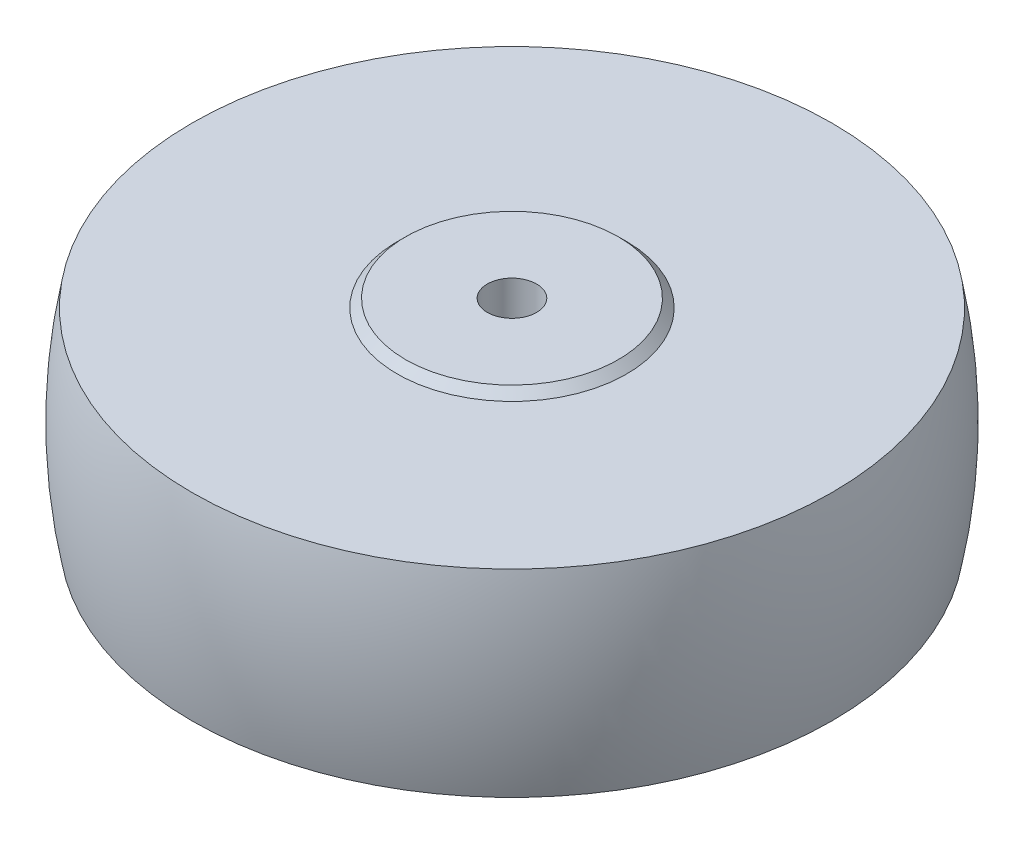
ISO-10303-21;
HEADER;
FILE_DESCRIPTION(('STEP AP214'),'2;1');
FILE_NAME('part.step','',(''),(''),'','','');
FILE_SCHEMA(('AUTOMOTIVE_DESIGN { 1 0 10303 214 1 1 1 1 }'));
ENDSEC;
DATA;
#1=APPLICATION_CONTEXT('core data for automotive mechanical design processes');
#2=APPLICATION_PROTOCOL_DEFINITION('international standard','automotive_design',2000,#1);
#3=PRODUCT_CONTEXT('',#1,'mechanical');
#4=PRODUCT('Part','Part','',(#3));
#5=PRODUCT_RELATED_PRODUCT_CATEGORY('part','',(#4));
#6=PRODUCT_DEFINITION_FORMATION('','',#4);
#7=PRODUCT_DEFINITION_CONTEXT('part definition',#1,'design');
#8=PRODUCT_DEFINITION('design','',#6,#7);
#9=PRODUCT_DEFINITION_SHAPE('','',#8);
#10=(LENGTH_UNIT() NAMED_UNIT(*) SI_UNIT(.MILLI.,.METRE.));
#11=(NAMED_UNIT(*) PLANE_ANGLE_UNIT() SI_UNIT($,.RADIAN.));
#12=(NAMED_UNIT(*) SI_UNIT($,.STERADIAN.) SOLID_ANGLE_UNIT());
#13=UNCERTAINTY_MEASURE_WITH_UNIT(LENGTH_MEASURE(1.E-05),#10,'distance_accuracy_value','');
#14=(GEOMETRIC_REPRESENTATION_CONTEXT(3) GLOBAL_UNCERTAINTY_ASSIGNED_CONTEXT((#13)) GLOBAL_UNIT_ASSIGNED_CONTEXT((#10,
#11,#12)) REPRESENTATION_CONTEXT('',''));
#15=CARTESIAN_POINT('',(0.,0.,0.));
#16=DIRECTION('',(0.,0.,1.));
#17=DIRECTION('',(1.,0.,0.));
#18=AXIS2_PLACEMENT_3D('',#15,#16,#17);
#19=CARTESIAN_POINT('',(-134.421042755759,201.725126118079,146.716684572446));
#20=DIRECTION('',(0.,-1.,0.));
#21=DIRECTION('',(-1.,0.,0.));
#22=AXIS2_PLACEMENT_3D('',#19,#20,#21);
#23=PLANE('',#22);
#24=CARTESIAN_POINT('',(-134.421042755759,201.725126118079,156.216684572446));
#25=DIRECTION('',(0.,-1.,0.));
#26=DIRECTION('',(0.,0.,1.));
#27=AXIS2_PLACEMENT_3D('',#24,#25,#26);
#28=CIRCLE('',#27,9.5);
#29=CARTESIAN_POINT('',(-134.421042755759,201.725126118079,165.716684572446));
#30=VERTEX_POINT('',#29);
#31=EDGE_CURVE('E71',#30,#30,#28,.T.);
#32=ORIENTED_EDGE('',*,*,#31,.T.);
#33=EDGE_LOOP('',(#32));
#34=FACE_BOUND('',#33,.T.);
#35=CARTESIAN_POINT('',(-134.421042755759,201.725126118079,156.216684572446));
#36=DIRECTION('',(0.,-1.,0.));
#37=DIRECTION('',(0.,0.,1.));
#38=AXIS2_PLACEMENT_3D('',#35,#36,#37);
#39=CIRCLE('',#38,41.);
#40=CARTESIAN_POINT('',(-134.421042755759,201.725126118079,197.216684572446));
#41=VERTEX_POINT('',#40);
#42=EDGE_CURVE('E85',#41,#41,#39,.T.);
#43=ORIENTED_EDGE('',*,*,#42,.F.);
#44=EDGE_LOOP('',(#43));
#45=FACE_BOUND('',#44,.T.);
#46=ADVANCED_FACE('F17',(#34,#45),#23,.F.);
#47=CARTESIAN_POINT('',(-134.421042755759,198.525126118079,32.9384706224334));
#48=DIRECTION('',(0.,-1.,0.));
#49=DIRECTION('',(-1.,0.,0.));
#50=AXIS2_PLACEMENT_3D('',#47,#48,#49);
#51=PLANE('',#50);
#52=CARTESIAN_POINT('',(-134.421042755759,198.525126118079,156.216684572446));
#53=DIRECTION('',(0.,-1.,0.));
#54=DIRECTION('',(0.,0.,1.));
#55=AXIS2_PLACEMENT_3D('',#52,#53,#54);
#56=CIRCLE('',#55,44.2);
#57=CARTESIAN_POINT('',(-134.421042755759,198.525126118079,112.016684572446));
#58=VERTEX_POINT('',#57);
#59=EDGE_CURVE('E79',#58,#58,#56,.T.);
#60=ORIENTED_EDGE('',*,*,#59,.T.);
#61=EDGE_LOOP('',(#60));
#62=FACE_BOUND('',#61,.T.);
#63=CARTESIAN_POINT('',(-134.421042755759,198.525126118079,156.216684572446));
#64=DIRECTION('',(0.,-1.,0.));
#65=DIRECTION('',(0.,0.,1.));
#66=AXIS2_PLACEMENT_3D('',#63,#64,#65);
#67=CIRCLE('',#66,123.278213950012);
#68=CARTESIAN_POINT('',(-134.421042755759,198.525126118079,32.9384706224334));
#69=VERTEX_POINT('',#68);
#70=EDGE_CURVE('E28',#69,#69,#67,.T.);
#71=ORIENTED_EDGE('',*,*,#70,.F.);
#72=EDGE_LOOP('',(#71));
#73=FACE_BOUND('',#72,.T.);
#74=ADVANCED_FACE('F19',(#62,#73),#51,.F.);
#75=CARTESIAN_POINT('',(-134.421042755759,119.125126118079,146.716684572446));
#76=DIRECTION('',(0.,1.,0.));
#77=DIRECTION('',(0.,0.,-1.));
#78=AXIS2_PLACEMENT_3D('',#75,#76,#77);
#79=PLANE('',#78);
#80=CARTESIAN_POINT('',(-134.421042755759,119.125126118079,156.216684572446));
#81=DIRECTION('',(0.,-1.,0.));
#82=DIRECTION('',(0.,0.,1.));
#83=AXIS2_PLACEMENT_3D('',#80,#81,#82);
#84=CIRCLE('',#83,9.5);
#85=CARTESIAN_POINT('',(-134.421042755759,119.125126118079,165.716684572446));
#86=VERTEX_POINT('',#85);
#87=EDGE_CURVE('E66',#86,#86,#84,.T.);
#88=ORIENTED_EDGE('',*,*,#87,.F.);
#89=EDGE_LOOP('',(#88));
#90=FACE_BOUND('',#89,.T.);
#91=CARTESIAN_POINT('',(-134.421042755759,119.125126118079,156.216684572446));
#92=DIRECTION('',(0.,-1.,0.));
#93=DIRECTION('',(0.,0.,1.));
#94=AXIS2_PLACEMENT_3D('',#91,#92,#93);
#95=CIRCLE('',#94,41.);
#96=CARTESIAN_POINT('',(-134.421042755759,119.125126118079,115.216684572446));
#97=VERTEX_POINT('',#96);
#98=EDGE_CURVE('E21',#97,#97,#95,.T.);
#99=ORIENTED_EDGE('',*,*,#98,.T.);
#100=EDGE_LOOP('',(#99));
#101=FACE_BOUND('',#100,.T.);
#102=ADVANCED_FACE('F108',(#90,#101),#79,.F.);
#103=CARTESIAN_POINT('',(-134.421042755759,122.325126118079,32.9384706224334));
#104=DIRECTION('',(0.,1.,0.));
#105=DIRECTION('',(0.,0.,-1.));
#106=AXIS2_PLACEMENT_3D('',#103,#104,#105);
#107=PLANE('',#106);
#108=CARTESIAN_POINT('',(-134.421042755759,122.325126118079,156.216684572446));
#109=DIRECTION('',(0.,-1.,0.));
#110=DIRECTION('',(0.,0.,1.));
#111=AXIS2_PLACEMENT_3D('',#108,#109,#110);
#112=CIRCLE('',#111,44.2);
#113=CARTESIAN_POINT('',(-134.421042755759,122.325126118079,112.016684572446));
#114=VERTEX_POINT('',#113);
#115=EDGE_CURVE('E77',#114,#114,#112,.T.);
#116=ORIENTED_EDGE('',*,*,#115,.F.);
#117=EDGE_LOOP('',(#116));
#118=FACE_BOUND('',#117,.T.);
#119=CARTESIAN_POINT('',(-134.421042755759,122.325126118079,156.216684572446));
#120=DIRECTION('',(0.,-1.,0.));
#121=DIRECTION('',(0.,0.,1.));
#122=AXIS2_PLACEMENT_3D('',#119,#120,#121);
#123=CIRCLE('',#122,123.278213950012);
#124=CARTESIAN_POINT('',(-134.421042755759,122.325126118079,279.494898522459));
#125=VERTEX_POINT('',#124);
#126=EDGE_CURVE('E11',#125,#125,#123,.T.);
#127=ORIENTED_EDGE('',*,*,#126,.T.);
#128=EDGE_LOOP('',(#127));
#129=FACE_BOUND('',#128,.T.);
#130=ADVANCED_FACE('F113',(#118,#129),#107,.F.);
#131=CARTESIAN_POINT('',(-134.421042755759,160.425126118079,156.216684572446));
#132=DIRECTION('',(0.,-1.,0.));
#133=DIRECTION('',(0.,0.,-1.));
#134=AXIS2_PLACEMENT_3D('',#131,#132,#133);
#135=DEGENERATE_TOROIDAL_SURFACE('',#134,69.876133087604,196.876133087604,.F.);
#136=ORIENTED_EDGE('',*,*,#126,.F.);
#137=EDGE_LOOP('',(#136));
#138=FACE_BOUND('',#137,.T.);
#139=ORIENTED_EDGE('',*,*,#70,.T.);
#140=EDGE_LOOP('',(#139));
#141=FACE_BOUND('',#140,.T.);
#142=ADVANCED_FACE('F116',(#138,#141),#135,.F.);
#143=CARTESIAN_POINT('',(-134.421042755759,122.325126118079,156.216684572446));
#144=DIRECTION('',(0.,1.,0.));
#145=DIRECTION('',(0.,0.,-1.));
#146=AXIS2_PLACEMENT_3D('',#143,#144,#145);
#147=CONICAL_SURFACE('',#146,44.2,0.785398163397448);
#148=ORIENTED_EDGE('',*,*,#115,.T.);
#149=EDGE_LOOP('',(#148));
#150=FACE_BOUND('',#149,.T.);
#151=ORIENTED_EDGE('',*,*,#98,.F.);
#152=EDGE_LOOP('',(#151));
#153=FACE_BOUND('',#152,.T.);
#154=ADVANCED_FACE('F114',(#150,#153),#147,.T.);
#155=CARTESIAN_POINT('',(-134.421042755759,118.921866973888,156.216684572446));
#156=DIRECTION('',(0.,-1.,0.));
#157=DIRECTION('',(0.,0.,1.));
#158=AXIS2_PLACEMENT_3D('',#155,#156,#157);
#159=CYLINDRICAL_SURFACE('',#158,9.5);
#160=ORIENTED_EDGE('',*,*,#87,.T.);
#161=EDGE_LOOP('',(#160));
#162=FACE_BOUND('',#161,.T.);
#163=ORIENTED_EDGE('',*,*,#31,.F.);
#164=EDGE_LOOP('',(#163));
#165=FACE_BOUND('',#164,.T.);
#166=ADVANCED_FACE('F67',(#162,#165),#159,.F.);
#167=CARTESIAN_POINT('',(-134.421042755759,198.525126118079,156.216684572446));
#168=DIRECTION('',(0.,-1.,0.));
#169=DIRECTION('',(0.,0.,-1.));
#170=AXIS2_PLACEMENT_3D('',#167,#168,#169);
#171=CONICAL_SURFACE('',#170,44.2,0.785398163397448);
#172=ORIENTED_EDGE('',*,*,#59,.F.);
#173=EDGE_LOOP('',(#172));
#174=FACE_BOUND('',#173,.T.);
#175=ORIENTED_EDGE('',*,*,#42,.T.);
#176=EDGE_LOOP('',(#175));
#177=FACE_BOUND('',#176,.T.);
#178=ADVANCED_FACE('F95',(#174,#177),#171,.T.);
#179=CLOSED_SHELL('',(#46,#74,#102,#130,#142,#154,#166,#178));
#180=MANIFOLD_SOLID_BREP('B1',#179);
#181=ADVANCED_BREP_SHAPE_REPRESENTATION('',(#18,#180),#14);
#182=SHAPE_DEFINITION_REPRESENTATION(#9,#181);
ENDSEC;
END-ISO-10303-21;
